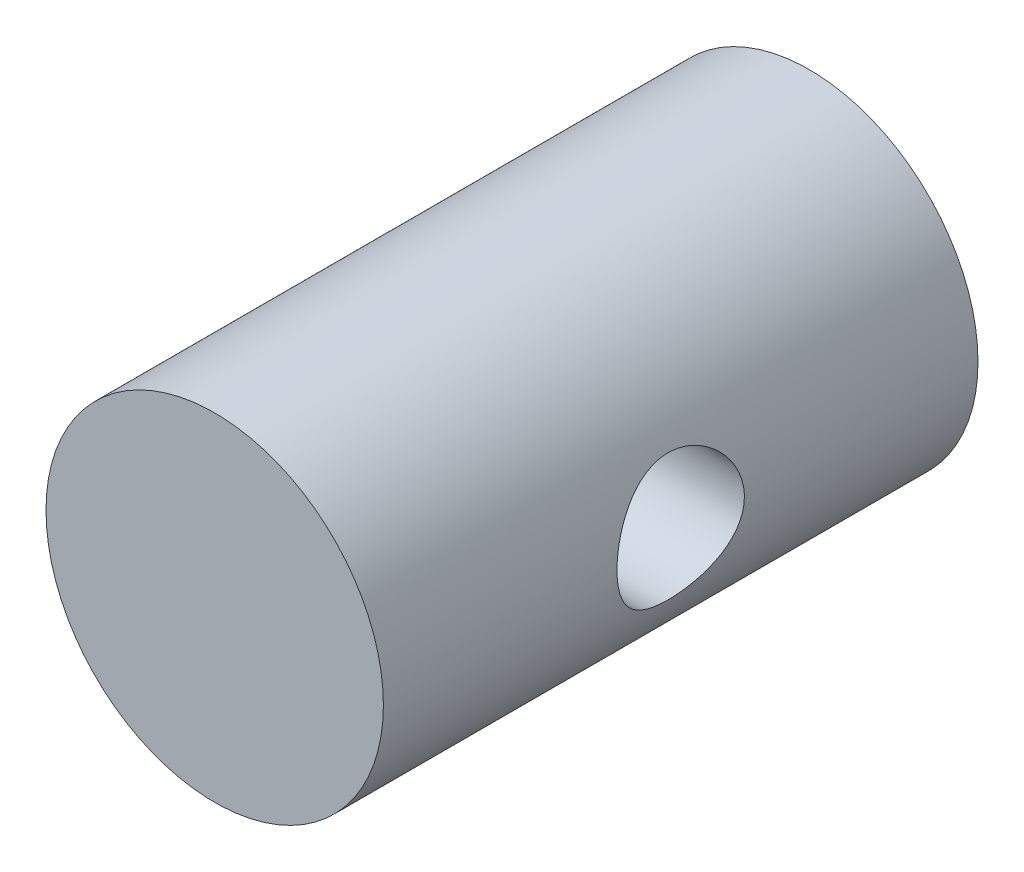
ISO-10303-21;
HEADER;
FILE_DESCRIPTION(('STEP AP214'),'2;1');
FILE_NAME('part.step','',(''),(''),'','','');
FILE_SCHEMA(('AUTOMOTIVE_DESIGN { 1 0 10303 214 1 1 1 1 }'));
ENDSEC;
DATA;
#1=APPLICATION_CONTEXT('core data for automotive mechanical design processes');
#2=APPLICATION_PROTOCOL_DEFINITION('international standard','automotive_design',2000,#1);
#3=PRODUCT_CONTEXT('',#1,'mechanical');
#4=PRODUCT('Part','Part','',(#3));
#5=PRODUCT_RELATED_PRODUCT_CATEGORY('part','',(#4));
#6=PRODUCT_DEFINITION_FORMATION('','',#4);
#7=PRODUCT_DEFINITION_CONTEXT('part definition',#1,'design');
#8=PRODUCT_DEFINITION('design','',#6,#7);
#9=PRODUCT_DEFINITION_SHAPE('','',#8);
#10=(LENGTH_UNIT() NAMED_UNIT(*) SI_UNIT(.MILLI.,.METRE.));
#11=(NAMED_UNIT(*) PLANE_ANGLE_UNIT() SI_UNIT($,.RADIAN.));
#12=(NAMED_UNIT(*) SI_UNIT($,.STERADIAN.) SOLID_ANGLE_UNIT());
#13=UNCERTAINTY_MEASURE_WITH_UNIT(LENGTH_MEASURE(1.E-05),#10,'distance_accuracy_value','');
#14=(GEOMETRIC_REPRESENTATION_CONTEXT(3) GLOBAL_UNCERTAINTY_ASSIGNED_CONTEXT((#13)) GLOBAL_UNIT_ASSIGNED_CONTEXT((#10,
#11,#12)) REPRESENTATION_CONTEXT('',''));
#15=CARTESIAN_POINT('',(0.,0.,0.));
#16=DIRECTION('',(0.,0.,1.));
#17=DIRECTION('',(1.,0.,0.));
#18=AXIS2_PLACEMENT_3D('',#15,#16,#17);
#19=CARTESIAN_POINT('',(0.,0.,44.45));
#20=DIRECTION('',(0.,0.,-1.));
#21=DIRECTION('',(-1.,0.,0.));
#22=AXIS2_PLACEMENT_3D('',#19,#20,#21);
#23=CYLINDRICAL_SURFACE('',#22,12.6111);
#24=CARTESIAN_POINT('',(-12.6111,0.,17.4625));
#25=CARTESIAN_POINT('',(-12.6111004722361,0.128862976552526,17.4624993622489));
#26=CARTESIAN_POINT('',(-12.6091206435443,0.257717143630975,17.4677341054764));
#27=CARTESIAN_POINT('',(-12.601255187836,0.514502566091206,17.4886205609225));
#28=CARTESIAN_POINT('',(-12.5953683235338,0.642433516129663,17.5042755730515));
#29=CARTESIAN_POINT('',(-12.5798502834723,0.896313030511023,17.5458369771117));
#30=CARTESIAN_POINT('',(-12.5702211540386,1.02226263918505,17.5717377666389));
#31=CARTESIAN_POINT('',(-12.5474709995072,1.2714055419563,17.6335496213075));
#32=CARTESIAN_POINT('',(-12.5343486173975,1.39459774468862,17.6694645768758));
#33=CARTESIAN_POINT('',(-12.5049884658138,1.63706374507099,17.7508812917139));
#34=CARTESIAN_POINT('',(-12.4887581681102,1.75634615269579,17.7963600837123));
#35=CARTESIAN_POINT('',(-12.4535767193222,1.9905596677062,17.8965672438076));
#36=CARTESIAN_POINT('',(-12.4346245595995,2.10548914198821,17.9512990421216));
#37=CARTESIAN_POINT('',(-12.3743779094373,2.44265493907785,18.1287544413042));
#38=CARTESIAN_POINT('',(-12.3296696411755,2.65745462135523,18.2648009474772));
#39=CARTESIAN_POINT('',(-12.2336740133425,3.06981329732062,18.5744084383447));
#40=CARTESIAN_POINT('',(-12.182198863926,3.26638187158735,18.749218673603));
#41=CARTESIAN_POINT('',(-12.0793466646827,3.62831039245088,19.1289593937256));
#42=CARTESIAN_POINT('',(-12.0279696504476,3.79366058911587,19.3338992530613));
#43=CARTESIAN_POINT('',(-11.9542145437369,4.01785223571506,19.6643395519393));
#44=CARTESIAN_POINT('',(-11.9297549673881,4.08971931117919,19.7807485300831));
#45=CARTESIAN_POINT('',(-11.8831095862018,4.22333395459359,20.0196525170608));
#46=CARTESIAN_POINT('',(-11.8609228700334,4.28508558445104,20.1421450571331));
#47=CARTESIAN_POINT('',(-11.8195385058146,4.39795086330441,20.3924363126384));
#48=CARTESIAN_POINT('',(-11.8003411952273,4.44906331150096,20.520235625074));
#49=CARTESIAN_POINT('',(-11.7656021362727,4.54013508098684,20.7801711837068));
#50=CARTESIAN_POINT('',(-11.7500586185165,4.58009980244153,20.9123052952559));
#51=CARTESIAN_POINT('',(-11.7237274881938,4.64707424198581,21.1744519770112));
#52=CARTESIAN_POINT('',(-11.7127708150585,4.67454848247866,21.3043289190763));
#53=CARTESIAN_POINT('',(-11.695104453116,4.71857390965456,21.5661532013901));
#54=CARTESIAN_POINT('',(-11.688392900984,4.73512988886175,21.6980996071831));
#55=CARTESIAN_POINT('',(-11.6794490776173,4.7571477146899,21.9630462254));
#56=CARTESIAN_POINT('',(-11.6772161098874,4.76261128636842,22.0960462707347));
#57=CARTESIAN_POINT('',(-11.6773083577455,4.76238528760445,22.3620324623262));
#58=CARTESIAN_POINT('',(-11.6796333930192,4.75669615836176,22.4950186089245));
#59=CARTESIAN_POINT('',(-11.6884771986291,4.734920210891,22.7517933720905));
#60=CARTESIAN_POINT('',(-11.6947310378631,4.71948996496729,22.8756474704062));
#61=CARTESIAN_POINT('',(-11.7109863842112,4.67900804276205,23.1215629876715));
#62=CARTESIAN_POINT('',(-11.7209891350087,4.65395317348875,23.2436237977261));
#63=CARTESIAN_POINT('',(-11.7444362430412,4.5944620781971,23.4850688836826));
#64=CARTESIAN_POINT('',(-11.7578797131094,4.56002827032961,23.6044538409184));
#65=CARTESIAN_POINT('',(-11.7878116047814,4.48208393861325,23.8398460470661));
#66=CARTESIAN_POINT('',(-11.804301195159,4.43856992992521,23.9558519796252));
#67=CARTESIAN_POINT('',(-11.8583287438212,4.2931065689821,24.3020034392571));
#68=CARTESIAN_POINT('',(-11.8999733430395,4.1773246518888,24.5258767898274));
#69=CARTESIAN_POINT('',(-11.9895597093227,3.91276702485298,24.951651604807));
#70=CARTESIAN_POINT('',(-12.0375036697051,3.76397981061763,25.1535453713657));
#71=CARTESIAN_POINT('',(-12.1382896678764,3.42563193526832,25.5442854873288));
#72=CARTESIAN_POINT('',(-12.1912426980375,3.23398185192097,25.7313015225587));
#73=CARTESIAN_POINT('',(-12.2932676691594,2.82143926505604,26.0710790513196));
#74=CARTESIAN_POINT('',(-12.3423389958432,2.60054214794458,26.223835130227));
#75=CARTESIAN_POINT('',(-12.432072840762,2.13104347352194,26.4928292009542));
#76=CARTESIAN_POINT('',(-12.4725894467813,1.88205766224884,26.608448740284));
#77=CARTESIAN_POINT('',(-12.5395639648448,1.36625800956828,26.7955487116121));
#78=CARTESIAN_POINT('',(-12.5660282123613,1.09945226342071,26.8670490370128));
#79=CARTESIAN_POINT('',(-12.6007983825756,0.571003693359811,26.9603397309205));
#80=CARTESIAN_POINT('',(-12.610004592501,0.309855309058185,26.984597455342));
#81=CARTESIAN_POINT('',(-12.6120091068914,-0.212912999425837,26.9899092092914));
#82=CARTESIAN_POINT('',(-12.6048111105567,-0.474532804007818,26.9709729791915));
#83=CARTESIAN_POINT('',(-12.5754093934802,-0.98010205467754,26.8923028962881));
#84=CARTESIAN_POINT('',(-12.5538031266296,-1.22434249385512,26.8341924355302));
#85=CARTESIAN_POINT('',(-12.4983612043534,-1.69942822090966,26.6809710939281));
#86=CARTESIAN_POINT('',(-12.4645239592449,-1.93027176303874,26.5858554033228));
#87=CARTESIAN_POINT('',(-12.3867113857139,-2.37966104578175,26.3582695061026));
#88=CARTESIAN_POINT('',(-12.3424661407921,-2.59764218637243,26.2247789853745));
#89=CARTESIAN_POINT('',(-12.2487290450928,-3.00882659834893,25.925424442631));
#90=CARTESIAN_POINT('',(-12.1992352413819,-3.20202058719196,25.759548350841));
#91=CARTESIAN_POINT('',(-12.0968009730811,-3.57013694572375,25.3884899738265));
#92=CARTESIAN_POINT('',(-12.0438290893082,-3.74331487192534,25.1815689698703));
#93=CARTESIAN_POINT('',(-11.9684249230052,-3.97533607508741,24.8510828319001));
#94=CARTESIAN_POINT('',(-11.9439521962455,-4.04808789550704,24.7374949886747));
#95=CARTESIAN_POINT('',(-11.8970751179239,-4.1838492673617,24.5042516209058));
#96=CARTESIAN_POINT('',(-11.8746698958222,-4.24686292673922,24.3845986833031));
#97=CARTESIAN_POINT('',(-11.8325165457034,-4.36293869895203,24.1393357208766));
#98=CARTESIAN_POINT('',(-11.812782760654,-4.41594765258999,24.0136980847906));
#99=CARTESIAN_POINT('',(-11.7767717494069,-4.51110622086789,23.7579482160176));
#100=CARTESIAN_POINT('',(-11.7604930499983,-4.55326046547857,23.6278379180338));
#101=CARTESIAN_POINT('',(-11.7319565307022,-4.62629211275277,23.364098246639));
#102=CARTESIAN_POINT('',(-11.7196974653842,-4.65717300865057,23.2304699771134));
#103=CARTESIAN_POINT('',(-11.699642953938,-4.70732736064793,22.9607243928433));
#104=CARTESIAN_POINT('',(-11.6918471902893,-4.7266016424501,22.8246072558685));
#105=CARTESIAN_POINT('',(-11.6813659655173,-4.75244265911458,22.559964417973));
#106=CARTESIAN_POINT('',(-11.6783801844823,-4.7597566583891,22.431523061222));
#107=CARTESIAN_POINT('',(-11.6766633456293,-4.76396711713917,22.1743950210167));
#108=CARTESIAN_POINT('',(-11.6779337220608,-4.7608600649054,22.0457082694717));
#109=CARTESIAN_POINT('',(-11.6846883184393,-4.74425772677472,21.7891813586458));
#110=CARTESIAN_POINT('',(-11.690170542657,-4.73076736087054,21.6613408273227));
#111=CARTESIAN_POINT('',(-11.7051655543185,-4.69354278652862,21.4073542643792));
#112=CARTESIAN_POINT('',(-11.7146798596275,-4.66980472031133,21.2812088893645));
#113=CARTESIAN_POINT('',(-11.7370684154224,-4.61323770980987,21.0355388550145));
#114=CARTESIAN_POINT('',(-11.7498259956304,-4.5807224024478,20.9159312921963));
#115=CARTESIAN_POINT('',(-11.7784513664691,-4.50660598434877,20.6799334962257));
#116=CARTESIAN_POINT('',(-11.7943202457776,-4.46500169269262,20.5635444055648));
#117=CARTESIAN_POINT('',(-11.8459373509188,-4.32704311685812,20.2203062354518));
#118=CARTESIAN_POINT('',(-11.8857137480344,-4.21750065231886,19.9992035365578));
#119=CARTESIAN_POINT('',(-11.9741051186947,-3.95981311793856,19.5663981801795));
#120=CARTESIAN_POINT('',(-12.0230765799683,-3.80993112790928,19.3558132057019));
#121=CARTESIAN_POINT('',(-12.1231634804967,-3.47831034124339,18.9617190015972));
#122=CARTESIAN_POINT('',(-12.174279602054,-3.29656134707171,18.7782184737975));
#123=CARTESIAN_POINT('',(-12.2500465959951,-2.99793050006821,18.5219792214219));
#124=CARTESIAN_POINT('',(-12.2758049419202,-2.89090385576119,18.4378312153894));
#125=CARTESIAN_POINT('',(-12.3257763625442,-2.66981284053247,18.2788606411557));
#126=CARTESIAN_POINT('',(-12.3499899997802,-2.55575106170619,18.204034668577));
#127=CARTESIAN_POINT('',(-12.3962101413897,-2.32123073252884,18.0642372993147));
#128=CARTESIAN_POINT('',(-12.418215414404,-2.20076867007307,17.9992713902623));
#129=CARTESIAN_POINT('',(-12.4593721099237,-1.95435007855644,17.8798119031985));
#130=CARTESIAN_POINT('',(-12.4785247388784,-1.82839590154105,17.825313895229));
#131=CARTESIAN_POINT('',(-12.5143024242597,-1.56542264969019,17.7248171526583));
#132=CARTESIAN_POINT('',(-12.5307535744228,-1.42816509423649,17.6793785154665));
#133=CARTESIAN_POINT('',(-12.5593608393362,-1.14972775670164,17.6011016795411));
#134=CARTESIAN_POINT('',(-12.5715188448486,-1.00854973087582,17.5682579332877));
#135=CARTESIAN_POINT('',(-12.5911398953952,-0.723494727836152,17.5155450263952));
#136=CARTESIAN_POINT('',(-12.5986038240565,-0.579618263838886,17.495673423814));
#137=CARTESIAN_POINT('',(-12.6085833107531,-0.290490690578325,17.4691520702167));
#138=CARTESIAN_POINT('',(-12.611099467749,-0.145239749843878,17.4625007188008));
#139=CARTESIAN_POINT('',(-12.6111,0.,17.4625));
#140=B_SPLINE_CURVE_WITH_KNOTS('',3,(#24,#25,#26,#27,#28,#29,#30,#31,#32,#33,#34,#35,#36,#37,
#38,#39,#40,#41,#42,#43,#44,#45,#46,#47,#48,#49,#50,#51,#52,#53,#54,#55,#56,#57,#58,#59,#60,#61,
#62,#63,#64,#65,#66,#67,#68,#69,#70,#71,#72,#73,#74,#75,#76,#77,#78,#79,#80,#81,#82,#83,#84,#85,
#86,#87,#88,#89,#90,#91,#92,#93,#94,#95,#96,#97,#98,#99,#100,#101,#102,#103,#104,#105,#106,#107,
#108,#109,#110,#111,#112,#113,#114,#115,#116,#117,#118,#119,#120,#121,#122,#123,#124,#125,#126,
#127,#128,#129,#130,#131,#132,#133,#134,#135,#136,#137,#138,#139),.UNSPECIFIED.,.T.,.F.,(4,2,2,
2,2,2,2,2,2,2,2,2,2,2,2,2,2,2,2,2,2,2,2,2,2,2,2,2,2,2,2,2,2,2,2,2,2,2,2,2,2,2,2,2,2,2,2,2,2,2,2,
2,2,2,2,2,2,4),(0.,0.386452828490798,0.773028097858164,1.15939227891826,1.54590676914261,
1.93150344472519,2.31724338103494,3.08813701870132,3.88889840764185,4.68990947325357,
5.10640628077122,5.52273542976535,5.93911154261876,6.35528560349419,6.75437295860412,
7.15328501921997,7.55213503748886,7.95096927760656,8.32543349470101,8.70002204863051,
9.07451411449924,9.44915016977763,10.2119450673799,10.9750062629429,11.7901349995937,
12.6053924728376,13.4335967095809,14.2614272347076,15.0447221791732,15.8278405056332,
16.5803527033291,17.3329627416184,18.1078015784716,18.8829297430619,19.7036754402327,
20.114547129945,20.525245021777,20.9380672061488,21.3507130124502,21.7632308448448,
22.1757193269655,22.5612865234997,22.9469836623858,23.3324981563252,23.7181579051575,
24.0915339535284,24.465040884196,25.2114959982229,25.9974769256226,26.7837098298061,
27.1989754527215,27.614088974589,28.0294326878603,28.4446002408182,28.8804930860305,
29.3161937176557,29.7518123071201,30.1873781588338),.UNSPECIFIED.);
#141=CARTESIAN_POINT('',(-12.6111,0.,17.4625));
#142=VERTEX_POINT('',#141);
#143=EDGE_CURVE('E10',#142,#142,#140,.T.);
#144=ORIENTED_EDGE('',*,*,#143,.T.);
#145=EDGE_LOOP('',(#144));
#146=FACE_BOUND('',#145,.T.);
#147=CARTESIAN_POINT('',(12.6111,0.,17.4625));
#148=CARTESIAN_POINT('',(12.6111004722361,-0.128862976552526,17.4624993622489));
#149=CARTESIAN_POINT('',(12.6091206435443,-0.257717143630975,17.4677341054764));
#150=CARTESIAN_POINT('',(12.601255187836,-0.514502566091206,17.4886205609225));
#151=CARTESIAN_POINT('',(12.5953683235338,-0.642433516129663,17.5042755730515));
#152=CARTESIAN_POINT('',(12.5798502834723,-0.896313030511023,17.5458369771117));
#153=CARTESIAN_POINT('',(12.5702211540386,-1.02226263918505,17.5717377666389));
#154=CARTESIAN_POINT('',(12.5474709995072,-1.2714055419563,17.6335496213075));
#155=CARTESIAN_POINT('',(12.5343486173975,-1.39459774468862,17.6694645768758));
#156=CARTESIAN_POINT('',(12.5049884658138,-1.63706374507099,17.7508812917139));
#157=CARTESIAN_POINT('',(12.4887581681102,-1.75634615269579,17.7963600837123));
#158=CARTESIAN_POINT('',(12.4535767193222,-1.9905596677062,17.8965672438076));
#159=CARTESIAN_POINT('',(12.4346245595995,-2.10548914198821,17.9512990421216));
#160=CARTESIAN_POINT('',(12.3743779094373,-2.44265493907785,18.1287544413042));
#161=CARTESIAN_POINT('',(12.3296696411755,-2.65745462135523,18.2648009474772));
#162=CARTESIAN_POINT('',(12.2336740133425,-3.06981329732062,18.5744084383447));
#163=CARTESIAN_POINT('',(12.182198863926,-3.26638187158735,18.749218673603));
#164=CARTESIAN_POINT('',(12.0793466646827,-3.62831039245088,19.1289593937256));
#165=CARTESIAN_POINT('',(12.0279696504476,-3.79366058911587,19.3338992530613));
#166=CARTESIAN_POINT('',(11.9542145437369,-4.01785223571506,19.6643395519393));
#167=CARTESIAN_POINT('',(11.9297549673881,-4.08971931117919,19.7807485300831));
#168=CARTESIAN_POINT('',(11.8831095862018,-4.22333395459359,20.0196525170608));
#169=CARTESIAN_POINT('',(11.8609228700334,-4.28508558445104,20.1421450571331));
#170=CARTESIAN_POINT('',(11.8195385058146,-4.39795086330441,20.3924363126384));
#171=CARTESIAN_POINT('',(11.8003411952273,-4.44906331150096,20.520235625074));
#172=CARTESIAN_POINT('',(11.7656021362727,-4.54013508098684,20.7801711837068));
#173=CARTESIAN_POINT('',(11.7500586185165,-4.58009980244153,20.9123052952559));
#174=CARTESIAN_POINT('',(11.7237274881938,-4.64707424198581,21.1744519770112));
#175=CARTESIAN_POINT('',(11.7127708150585,-4.67454848247866,21.3043289190763));
#176=CARTESIAN_POINT('',(11.695104453116,-4.71857390965456,21.5661532013901));
#177=CARTESIAN_POINT('',(11.688392900984,-4.73512988886175,21.6980996071831));
#178=CARTESIAN_POINT('',(11.6794490776173,-4.7571477146899,21.9630462254));
#179=CARTESIAN_POINT('',(11.6772161098874,-4.76261128636842,22.0960462707347));
#180=CARTESIAN_POINT('',(11.6773083577455,-4.76238528760445,22.3620324623262));
#181=CARTESIAN_POINT('',(11.6796333930192,-4.75669615836176,22.4950186089245));
#182=CARTESIAN_POINT('',(11.6884771986291,-4.734920210891,22.7517933720905));
#183=CARTESIAN_POINT('',(11.6947310378631,-4.71948996496729,22.8756474704062));
#184=CARTESIAN_POINT('',(11.7109863842112,-4.67900804276205,23.1215629876715));
#185=CARTESIAN_POINT('',(11.7209891350087,-4.65395317348875,23.2436237977261));
#186=CARTESIAN_POINT('',(11.7444362430412,-4.5944620781971,23.4850688836826));
#187=CARTESIAN_POINT('',(11.7578797131094,-4.56002827032961,23.6044538409184));
#188=CARTESIAN_POINT('',(11.7878116047814,-4.48208393861325,23.8398460470661));
#189=CARTESIAN_POINT('',(11.804301195159,-4.43856992992521,23.9558519796252));
#190=CARTESIAN_POINT('',(11.8583287438212,-4.2931065689821,24.3020034392571));
#191=CARTESIAN_POINT('',(11.8999733430395,-4.1773246518888,24.5258767898274));
#192=CARTESIAN_POINT('',(11.9895597093227,-3.91276702485298,24.951651604807));
#193=CARTESIAN_POINT('',(12.0375036697051,-3.76397981061763,25.1535453713657));
#194=CARTESIAN_POINT('',(12.1382896678764,-3.42563193526832,25.5442854873288));
#195=CARTESIAN_POINT('',(12.1912426980375,-3.23398185192097,25.7313015225587));
#196=CARTESIAN_POINT('',(12.2932676691594,-2.82143926505604,26.0710790513196));
#197=CARTESIAN_POINT('',(12.3423389958432,-2.60054214794458,26.223835130227));
#198=CARTESIAN_POINT('',(12.432072840762,-2.13104347352194,26.4928292009542));
#199=CARTESIAN_POINT('',(12.4725894467813,-1.88205766224884,26.608448740284));
#200=CARTESIAN_POINT('',(12.5395639648448,-1.36625800956828,26.7955487116121));
#201=CARTESIAN_POINT('',(12.5660282123613,-1.09945226342071,26.8670490370128));
#202=CARTESIAN_POINT('',(12.6007983825756,-0.571003693359811,26.9603397309205));
#203=CARTESIAN_POINT('',(12.610004592501,-0.309855309058185,26.984597455342));
#204=CARTESIAN_POINT('',(12.6120091068914,0.212912999425837,26.9899092092914));
#205=CARTESIAN_POINT('',(12.6048111105567,0.474532804007818,26.9709729791915));
#206=CARTESIAN_POINT('',(12.5754093934802,0.98010205467754,26.8923028962881));
#207=CARTESIAN_POINT('',(12.5538031266296,1.22434249385512,26.8341924355302));
#208=CARTESIAN_POINT('',(12.4983612043534,1.69942822090966,26.6809710939281));
#209=CARTESIAN_POINT('',(12.4645239592449,1.93027176303874,26.5858554033228));
#210=CARTESIAN_POINT('',(12.3867113857139,2.37966104578175,26.3582695061026));
#211=CARTESIAN_POINT('',(12.3424661407921,2.59764218637243,26.2247789853745));
#212=CARTESIAN_POINT('',(12.2487290450928,3.00882659834893,25.925424442631));
#213=CARTESIAN_POINT('',(12.1992352413819,3.20202058719196,25.759548350841));
#214=CARTESIAN_POINT('',(12.0968009730811,3.57013694572375,25.3884899738265));
#215=CARTESIAN_POINT('',(12.0438290893082,3.74331487192534,25.1815689698703));
#216=CARTESIAN_POINT('',(11.9684249230052,3.97533607508741,24.8510828319001));
#217=CARTESIAN_POINT('',(11.9439521962455,4.04808789550704,24.7374949886747));
#218=CARTESIAN_POINT('',(11.8970751179239,4.1838492673617,24.5042516209058));
#219=CARTESIAN_POINT('',(11.8746698958222,4.24686292673922,24.3845986833031));
#220=CARTESIAN_POINT('',(11.8325165457034,4.36293869895203,24.1393357208766));
#221=CARTESIAN_POINT('',(11.812782760654,4.41594765258999,24.0136980847906));
#222=CARTESIAN_POINT('',(11.7767717494069,4.51110622086789,23.7579482160176));
#223=CARTESIAN_POINT('',(11.7604930499983,4.55326046547857,23.6278379180338));
#224=CARTESIAN_POINT('',(11.7319565307022,4.62629211275277,23.364098246639));
#225=CARTESIAN_POINT('',(11.7196974653842,4.65717300865057,23.2304699771134));
#226=CARTESIAN_POINT('',(11.699642953938,4.70732736064793,22.9607243928433));
#227=CARTESIAN_POINT('',(11.6918471902893,4.7266016424501,22.8246072558685));
#228=CARTESIAN_POINT('',(11.6813659655173,4.75244265911458,22.559964417973));
#229=CARTESIAN_POINT('',(11.6783801844823,4.7597566583891,22.431523061222));
#230=CARTESIAN_POINT('',(11.6766633456293,4.76396711713917,22.1743950210167));
#231=CARTESIAN_POINT('',(11.6779337220608,4.7608600649054,22.0457082694717));
#232=CARTESIAN_POINT('',(11.6846883184393,4.74425772677472,21.7891813586458));
#233=CARTESIAN_POINT('',(11.690170542657,4.73076736087054,21.6613408273227));
#234=CARTESIAN_POINT('',(11.7051655543185,4.69354278652862,21.4073542643792));
#235=CARTESIAN_POINT('',(11.7146798596275,4.66980472031133,21.2812088893645));
#236=CARTESIAN_POINT('',(11.7370684154224,4.61323770980987,21.0355388550145));
#237=CARTESIAN_POINT('',(11.7498259956304,4.5807224024478,20.9159312921963));
#238=CARTESIAN_POINT('',(11.7784513664691,4.50660598434877,20.6799334962257));
#239=CARTESIAN_POINT('',(11.7943202457776,4.46500169269262,20.5635444055648));
#240=CARTESIAN_POINT('',(11.8459373509188,4.32704311685812,20.2203062354518));
#241=CARTESIAN_POINT('',(11.8857137480344,4.21750065231886,19.9992035365578));
#242=CARTESIAN_POINT('',(11.9741051186947,3.95981311793856,19.5663981801795));
#243=CARTESIAN_POINT('',(12.0230765799683,3.80993112790928,19.3558132057019));
#244=CARTESIAN_POINT('',(12.1231634804967,3.47831034124339,18.9617190015972));
#245=CARTESIAN_POINT('',(12.174279602054,3.29656134707171,18.7782184737975));
#246=CARTESIAN_POINT('',(12.2500465959951,2.99793050006821,18.5219792214219));
#247=CARTESIAN_POINT('',(12.2758049419202,2.89090385576119,18.4378312153894));
#248=CARTESIAN_POINT('',(12.3257763625442,2.66981284053247,18.2788606411557));
#249=CARTESIAN_POINT('',(12.3499899997802,2.55575106170619,18.204034668577));
#250=CARTESIAN_POINT('',(12.3962101413897,2.32123073252884,18.0642372993147));
#251=CARTESIAN_POINT('',(12.418215414404,2.20076867007307,17.9992713902623));
#252=CARTESIAN_POINT('',(12.4593721099237,1.95435007855644,17.8798119031985));
#253=CARTESIAN_POINT('',(12.4785247388784,1.82839590154105,17.825313895229));
#254=CARTESIAN_POINT('',(12.5143024242597,1.56542264969019,17.7248171526583));
#255=CARTESIAN_POINT('',(12.5307535744228,1.42816509423649,17.6793785154665));
#256=CARTESIAN_POINT('',(12.5593608393362,1.14972775670164,17.6011016795411));
#257=CARTESIAN_POINT('',(12.5715188448486,1.00854973087582,17.5682579332877));
#258=CARTESIAN_POINT('',(12.5911398953952,0.723494727836152,17.5155450263952));
#259=CARTESIAN_POINT('',(12.5986038240565,0.579618263838886,17.495673423814));
#260=CARTESIAN_POINT('',(12.6085833107531,0.290490690578325,17.4691520702167));
#261=CARTESIAN_POINT('',(12.611099467749,0.145239749843878,17.4625007188008));
#262=CARTESIAN_POINT('',(12.6111,0.,17.4625));
#263=B_SPLINE_CURVE_WITH_KNOTS('',3,(#147,#148,#149,#150,#151,#152,#153,#154,#155,#156,#157,
#158,#159,#160,#161,#162,#163,#164,#165,#166,#167,#168,#169,#170,#171,#172,#173,#174,#175,#176,
#177,#178,#179,#180,#181,#182,#183,#184,#185,#186,#187,#188,#189,#190,#191,#192,#193,#194,#195,
#196,#197,#198,#199,#200,#201,#202,#203,#204,#205,#206,#207,#208,#209,#210,#211,#212,#213,#214,
#215,#216,#217,#218,#219,#220,#221,#222,#223,#224,#225,#226,#227,#228,#229,#230,#231,#232,#233,
#234,#235,#236,#237,#238,#239,#240,#241,#242,#243,#244,#245,#246,#247,#248,#249,#250,#251,#252,
#253,#254,#255,#256,#257,#258,#259,#260,#261,#262),.UNSPECIFIED.,.T.,.F.,(4,2,2,2,2,2,2,2,2,2,2,
2,2,2,2,2,2,2,2,2,2,2,2,2,2,2,2,2,2,2,2,2,2,2,2,2,2,2,2,2,2,2,2,2,2,2,2,2,2,2,2,2,2,2,2,2,2,4),
(0.,0.386452828490798,0.773028097858164,1.15939227891826,1.54590676914261,1.93150344472519,
2.31724338103494,3.08813701870132,3.88889840764185,4.68990947325357,5.10640628077122,
5.52273542976535,5.93911154261876,6.35528560349419,6.75437295860412,7.15328501921997,
7.55213503748886,7.95096927760656,8.32543349470101,8.70002204863051,9.07451411449924,
9.44915016977763,10.2119450673799,10.9750062629429,11.7901349995937,12.6053924728376,
13.4335967095809,14.2614272347076,15.0447221791732,15.8278405056332,16.5803527033291,
17.3329627416184,18.1078015784716,18.8829297430619,19.7036754402327,20.114547129945,
20.525245021777,20.9380672061488,21.3507130124502,21.7632308448448,22.1757193269655,
22.5612865234997,22.9469836623858,23.3324981563252,23.7181579051575,24.0915339535284,
24.465040884196,25.2114959982229,25.9974769256226,26.7837098298061,27.1989754527215,
27.614088974589,28.0294326878603,28.4446002408182,28.8804930860305,29.3161937176557,
29.7518123071201,30.1873781588338),.UNSPECIFIED.);
#264=CARTESIAN_POINT('',(12.6111,0.,17.4625));
#265=VERTEX_POINT('',#264);
#266=EDGE_CURVE('E55',#265,#265,#263,.T.);
#267=ORIENTED_EDGE('',*,*,#266,.T.);
#268=EDGE_LOOP('',(#267));
#269=FACE_BOUND('',#268,.T.);
#270=CARTESIAN_POINT('',(0.,0.,44.45));
#271=DIRECTION('',(0.,0.,1.));
#272=DIRECTION('',(1.,0.,0.));
#273=AXIS2_PLACEMENT_3D('',#270,#271,#272);
#274=CIRCLE('',#273,12.6111);
#275=CARTESIAN_POINT('',(12.6111,0.,44.45));
#276=VERTEX_POINT('',#275);
#277=EDGE_CURVE('E60',#276,#276,#274,.T.);
#278=ORIENTED_EDGE('',*,*,#277,.F.);
#279=EDGE_LOOP('',(#278));
#280=FACE_BOUND('',#279,.T.);
#281=CARTESIAN_POINT('',(0.,0.,0.));
#282=DIRECTION('',(0.,0.,1.));
#283=DIRECTION('',(1.,0.,0.));
#284=AXIS2_PLACEMENT_3D('',#281,#282,#283);
#285=CIRCLE('',#284,12.6111);
#286=CARTESIAN_POINT('',(12.6111,0.,0.));
#287=VERTEX_POINT('',#286);
#288=EDGE_CURVE('E65',#287,#287,#285,.T.);
#289=ORIENTED_EDGE('',*,*,#288,.T.);
#290=EDGE_LOOP('',(#289));
#291=FACE_BOUND('',#290,.T.);
#292=ADVANCED_FACE('F43',(#146,#269,#280,#291),#23,.T.);
#293=CARTESIAN_POINT('',(0.,0.,44.45));
#294=DIRECTION('',(0.,0.,1.));
#295=DIRECTION('',(1.,0.,0.));
#296=AXIS2_PLACEMENT_3D('',#293,#294,#295);
#297=PLANE('',#296);
#298=ORIENTED_EDGE('',*,*,#277,.T.);
#299=EDGE_LOOP('',(#298));
#300=FACE_BOUND('',#299,.T.);
#301=ADVANCED_FACE('F77',(#300),#297,.T.);
#302=CARTESIAN_POINT('',(0.,0.,0.));
#303=DIRECTION('',(0.,0.,1.));
#304=DIRECTION('',(1.,0.,0.));
#305=AXIS2_PLACEMENT_3D('',#302,#303,#304);
#306=PLANE('',#305);
#307=ORIENTED_EDGE('',*,*,#288,.F.);
#308=EDGE_LOOP('',(#307));
#309=FACE_BOUND('',#308,.T.);
#310=ADVANCED_FACE('F75',(#309),#306,.F.);
#311=CARTESIAN_POINT('',(-12.6111,0.,22.225));
#312=DIRECTION('',(1.,0.,0.));
#313=DIRECTION('',(0.,0.,-1.));
#314=AXIS2_PLACEMENT_3D('',#311,#312,#313);
#315=CYLINDRICAL_SURFACE('',#314,4.7625);
#316=ORIENTED_EDGE('',*,*,#266,.F.);
#317=EDGE_LOOP('',(#316));
#318=FACE_BOUND('',#317,.T.);
#319=ORIENTED_EDGE('',*,*,#143,.F.);
#320=EDGE_LOOP('',(#319));
#321=FACE_BOUND('',#320,.T.);
#322=ADVANCED_FACE('F71',(#318,#321),#315,.F.);
#323=CLOSED_SHELL('',(#292,#301,#310,#322));
#324=MANIFOLD_SOLID_BREP('B2',#323);
#325=ADVANCED_BREP_SHAPE_REPRESENTATION('',(#18,#324),#14);
#326=SHAPE_DEFINITION_REPRESENTATION(#9,#325);
ENDSEC;
END-ISO-10303-21;
